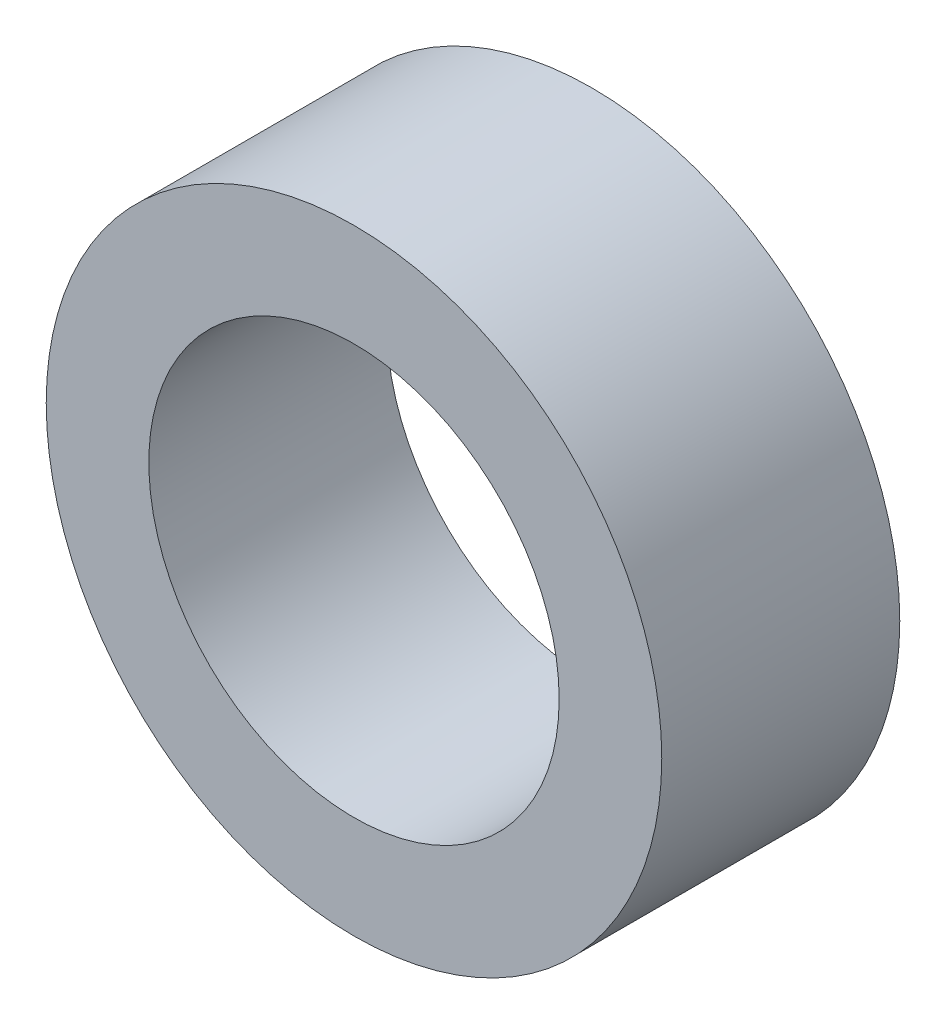
ISO-10303-21;
HEADER;
FILE_DESCRIPTION(('STEP AP214'),'2;1');
FILE_NAME('part.step','',(''),(''),'','','');
FILE_SCHEMA(('AUTOMOTIVE_DESIGN { 1 0 10303 214 1 1 1 1 }'));
ENDSEC;
DATA;
#1=APPLICATION_CONTEXT('core data for automotive mechanical design processes');
#2=APPLICATION_PROTOCOL_DEFINITION('international standard','automotive_design',2000,#1);
#3=PRODUCT_CONTEXT('',#1,'mechanical');
#4=PRODUCT('Part','Part','',(#3));
#5=PRODUCT_RELATED_PRODUCT_CATEGORY('part','',(#4));
#6=PRODUCT_DEFINITION_FORMATION('','',#4);
#7=PRODUCT_DEFINITION_CONTEXT('part definition',#1,'design');
#8=PRODUCT_DEFINITION('design','',#6,#7);
#9=PRODUCT_DEFINITION_SHAPE('','',#8);
#10=(LENGTH_UNIT() NAMED_UNIT(*) SI_UNIT(.MILLI.,.METRE.));
#11=(NAMED_UNIT(*) PLANE_ANGLE_UNIT() SI_UNIT($,.RADIAN.));
#12=(NAMED_UNIT(*) SI_UNIT($,.STERADIAN.) SOLID_ANGLE_UNIT());
#13=UNCERTAINTY_MEASURE_WITH_UNIT(LENGTH_MEASURE(1.E-05),#10,'distance_accuracy_value','');
#14=(GEOMETRIC_REPRESENTATION_CONTEXT(3) GLOBAL_UNCERTAINTY_ASSIGNED_CONTEXT((#13)) GLOBAL_UNIT_ASSIGNED_CONTEXT((#10,
#11,#12)) REPRESENTATION_CONTEXT('',''));
#15=CARTESIAN_POINT('',(0.,0.,0.));
#16=DIRECTION('',(0.,0.,1.));
#17=DIRECTION('',(1.,0.,0.));
#18=AXIS2_PLACEMENT_3D('',#15,#16,#17);
#19=CARTESIAN_POINT('',(0.,0.,5.8));
#20=DIRECTION('',(0.,0.,1.));
#21=DIRECTION('',(1.,0.,0.));
#22=AXIS2_PLACEMENT_3D('',#19,#20,#21);
#23=PLANE('',#22);
#24=CARTESIAN_POINT('',(0.,0.,5.8));
#25=DIRECTION('',(0.,0.,1.));
#26=DIRECTION('',(1.,0.,0.));
#27=AXIS2_PLACEMENT_3D('',#24,#25,#26);
#28=CIRCLE('',#27,7.5);
#29=CARTESIAN_POINT('',(7.5,0.,5.8));
#30=VERTEX_POINT('',#29);
#31=EDGE_CURVE('E10',#30,#30,#28,.T.);
#32=ORIENTED_EDGE('',*,*,#31,.T.);
#33=EDGE_LOOP('',(#32));
#34=FACE_BOUND('',#33,.T.);
#35=CARTESIAN_POINT('',(0.,0.,5.8));
#36=DIRECTION('',(0.,0.,1.));
#37=DIRECTION('',(1.,0.,0.));
#38=AXIS2_PLACEMENT_3D('',#35,#36,#37);
#39=CIRCLE('',#38,5.);
#40=CARTESIAN_POINT('',(5.,0.,5.8));
#41=VERTEX_POINT('',#40);
#42=EDGE_CURVE('E49',#41,#41,#39,.T.);
#43=ORIENTED_EDGE('',*,*,#42,.F.);
#44=EDGE_LOOP('',(#43));
#45=FACE_BOUND('',#44,.T.);
#46=ADVANCED_FACE('F36',(#34,#45),#23,.T.);
#47=CARTESIAN_POINT('',(0.,0.,0.));
#48=DIRECTION('',(0.,0.,1.));
#49=DIRECTION('',(1.,0.,0.));
#50=AXIS2_PLACEMENT_3D('',#47,#48,#49);
#51=PLANE('',#50);
#52=CARTESIAN_POINT('',(0.,0.,0.));
#53=DIRECTION('',(0.,0.,1.));
#54=DIRECTION('',(1.,0.,0.));
#55=AXIS2_PLACEMENT_3D('',#52,#53,#54);
#56=CIRCLE('',#55,7.5);
#57=CARTESIAN_POINT('',(7.5,0.,0.));
#58=VERTEX_POINT('',#57);
#59=EDGE_CURVE('E40',#58,#58,#56,.T.);
#60=ORIENTED_EDGE('',*,*,#59,.F.);
#61=EDGE_LOOP('',(#60));
#62=FACE_BOUND('',#61,.T.);
#63=CARTESIAN_POINT('',(0.,0.,0.));
#64=DIRECTION('',(0.,0.,1.));
#65=DIRECTION('',(1.,0.,0.));
#66=AXIS2_PLACEMENT_3D('',#63,#64,#65);
#67=CIRCLE('',#66,5.);
#68=CARTESIAN_POINT('',(5.,0.,0.));
#69=VERTEX_POINT('',#68);
#70=EDGE_CURVE('E51',#69,#69,#67,.T.);
#71=ORIENTED_EDGE('',*,*,#70,.T.);
#72=EDGE_LOOP('',(#71));
#73=FACE_BOUND('',#72,.T.);
#74=ADVANCED_FACE('F63',(#62,#73),#51,.F.);
#75=CARTESIAN_POINT('',(0.,0.,5.8));
#76=DIRECTION('',(0.,0.,-1.));
#77=DIRECTION('',(-1.,0.,0.));
#78=AXIS2_PLACEMENT_3D('',#75,#76,#77);
#79=CYLINDRICAL_SURFACE('',#78,7.5);
#80=ORIENTED_EDGE('',*,*,#31,.F.);
#81=EDGE_LOOP('',(#80));
#82=FACE_BOUND('',#81,.T.);
#83=ORIENTED_EDGE('',*,*,#59,.T.);
#84=EDGE_LOOP('',(#83));
#85=FACE_BOUND('',#84,.T.);
#86=ADVANCED_FACE('F38',(#82,#85),#79,.T.);
#87=CARTESIAN_POINT('',(0.,0.,5.8));
#88=DIRECTION('',(0.,0.,-1.));
#89=DIRECTION('',(-1.,0.,0.));
#90=AXIS2_PLACEMENT_3D('',#87,#88,#89);
#91=CYLINDRICAL_SURFACE('',#90,5.);
#92=ORIENTED_EDGE('',*,*,#42,.T.);
#93=EDGE_LOOP('',(#92));
#94=FACE_BOUND('',#93,.T.);
#95=ORIENTED_EDGE('',*,*,#70,.F.);
#96=EDGE_LOOP('',(#95));
#97=FACE_BOUND('',#96,.T.);
#98=ADVANCED_FACE('F59',(#94,#97),#91,.F.);
#99=CLOSED_SHELL('',(#46,#74,#86,#98));
#100=MANIFOLD_SOLID_BREP('B2',#99);
#101=ADVANCED_BREP_SHAPE_REPRESENTATION('',(#18,#100),#14);
#102=SHAPE_DEFINITION_REPRESENTATION(#9,#101);
ENDSEC;
END-ISO-10303-21;
